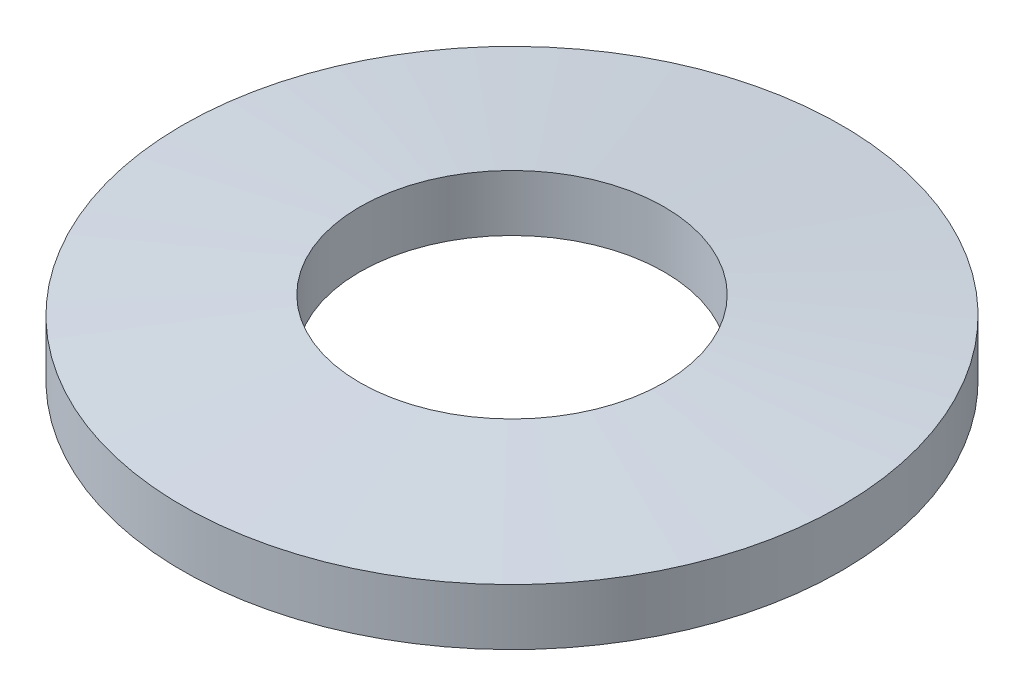
ISO-10303-21;
HEADER;
FILE_DESCRIPTION(('STEP AP214'),'2;1');
FILE_NAME('part.step','',(''),(''),'','','');
FILE_SCHEMA(('AUTOMOTIVE_DESIGN { 1 0 10303 214 1 1 1 1 }'));
ENDSEC;
DATA;
#1=APPLICATION_CONTEXT('core data for automotive mechanical design processes');
#2=APPLICATION_PROTOCOL_DEFINITION('international standard','automotive_design',2000,#1);
#3=PRODUCT_CONTEXT('',#1,'mechanical');
#4=PRODUCT('Part','Part','',(#3));
#5=PRODUCT_RELATED_PRODUCT_CATEGORY('part','',(#4));
#6=PRODUCT_DEFINITION_FORMATION('','',#4);
#7=PRODUCT_DEFINITION_CONTEXT('part definition',#1,'design');
#8=PRODUCT_DEFINITION('design','',#6,#7);
#9=PRODUCT_DEFINITION_SHAPE('','',#8);
#10=(LENGTH_UNIT() NAMED_UNIT(*) SI_UNIT(.MILLI.,.METRE.));
#11=(NAMED_UNIT(*) PLANE_ANGLE_UNIT() SI_UNIT($,.RADIAN.));
#12=(NAMED_UNIT(*) SI_UNIT($,.STERADIAN.) SOLID_ANGLE_UNIT());
#13=UNCERTAINTY_MEASURE_WITH_UNIT(LENGTH_MEASURE(1.E-05),#10,'distance_accuracy_value','');
#14=(GEOMETRIC_REPRESENTATION_CONTEXT(3) GLOBAL_UNCERTAINTY_ASSIGNED_CONTEXT((#13)) GLOBAL_UNIT_ASSIGNED_CONTEXT((#10,
#11,#12)) REPRESENTATION_CONTEXT('',''));
#15=CARTESIAN_POINT('',(0.,0.,0.));
#16=DIRECTION('',(0.,0.,1.));
#17=DIRECTION('',(1.,0.,0.));
#18=AXIS2_PLACEMENT_3D('',#15,#16,#17);
#19=CARTESIAN_POINT('',(0.,21.40585,0.));
#20=DIRECTION('',(0.,-1.,0.));
#21=DIRECTION('',(0.,0.,-1.));
#22=AXIS2_PLACEMENT_3D('',#19,#20,#21);
#23=CONICAL_SURFACE('',#22,3.2258,1.46978988245967);
#24=CARTESIAN_POINT('',(0.,21.02485,0.));
#25=DIRECTION('',(0.,-1.,0.));
#26=DIRECTION('',(-0.104021762769689,0.,-0.994575021237858));
#27=AXIS2_PLACEMENT_3D('',#24,#25,#26);
#28=CIRCLE('',#27,6.985);
#29=CARTESIAN_POINT('',(-0.726592012946279,21.02485,-6.94710652334644));
#30=VERTEX_POINT('',#29);
#31=EDGE_CURVE('E35',#30,#30,#28,.F.);
#32=ORIENTED_EDGE('',*,*,#31,.F.);
#33=EDGE_LOOP('',(#32));
#34=FACE_BOUND('',#33,.T.);
#35=CARTESIAN_POINT('',(0.,21.40585,0.));
#36=DIRECTION('',(0.,-1.,0.));
#37=DIRECTION('',(-0.104021762769689,0.,-0.994575021237859));
#38=AXIS2_PLACEMENT_3D('',#35,#36,#37);
#39=CIRCLE('',#38,3.2258);
#40=CARTESIAN_POINT('',(-0.335553402342463,21.40585,-3.20830010350908));
#41=VERTEX_POINT('',#40);
#42=EDGE_CURVE('E26',#41,#41,#39,.T.);
#43=ORIENTED_EDGE('',*,*,#42,.F.);
#44=EDGE_LOOP('',(#43));
#45=FACE_BOUND('',#44,.T.);
#46=ADVANCED_FACE('F14',(#34,#45),#23,.F.);
#47=CARTESIAN_POINT('',(0.,22.21865,0.));
#48=DIRECTION('',(0.,-1.,0.));
#49=DIRECTION('',(0.,0.,-1.));
#50=AXIS2_PLACEMENT_3D('',#47,#48,#49);
#51=CYLINDRICAL_SURFACE('',#50,6.985);
#52=CARTESIAN_POINT('',(0.,22.2186499528748,0.));
#53=DIRECTION('',(0.,-1.,0.));
#54=DIRECTION('',(-0.104021762769689,0.,-0.994575021237858));
#55=AXIS2_PLACEMENT_3D('',#52,#53,#54);
#56=CIRCLE('',#55,6.9849999952238);
#57=CARTESIAN_POINT('',(-0.72659201244945,22.2186499528748,-6.94710651859615));
#58=VERTEX_POINT('',#57);
#59=EDGE_CURVE('E21',#58,#58,#56,.F.);
#60=ORIENTED_EDGE('',*,*,#59,.F.);
#61=EDGE_LOOP('',(#60));
#62=FACE_BOUND('',#61,.T.);
#63=ORIENTED_EDGE('',*,*,#31,.T.);
#64=EDGE_LOOP('',(#63));
#65=FACE_BOUND('',#64,.T.);
#66=ADVANCED_FACE('F40',(#62,#65),#51,.T.);
#67=CARTESIAN_POINT('',(0.,22.59965,0.));
#68=DIRECTION('',(0.,-1.,0.));
#69=DIRECTION('',(0.,0.,-1.));
#70=AXIS2_PLACEMENT_3D('',#67,#68,#69);
#71=CYLINDRICAL_SURFACE('',#70,3.2258);
#72=ORIENTED_EDGE('',*,*,#42,.T.);
#73=EDGE_LOOP('',(#72));
#74=FACE_BOUND('',#73,.T.);
#75=CARTESIAN_POINT('',(0.,22.5996500471252,0.));
#76=DIRECTION('',(0.,-1.,0.));
#77=DIRECTION('',(-0.104021762769689,0.,-0.994575021237858));
#78=AXIS2_PLACEMENT_3D('',#75,#76,#77);
#79=CIRCLE('',#78,3.2258000047762);
#80=CARTESIAN_POINT('',(-0.335553402839293,22.5996500471252,-3.20830010825937));
#81=VERTEX_POINT('',#80);
#82=EDGE_CURVE('E9',#81,#81,#79,.T.);
#83=ORIENTED_EDGE('',*,*,#82,.F.);
#84=EDGE_LOOP('',(#83));
#85=FACE_BOUND('',#84,.T.);
#86=ADVANCED_FACE('F46',(#74,#85),#71,.F.);
#87=CARTESIAN_POINT('',(0.,22.5996500471252,0.));
#88=DIRECTION('',(0.,-1.,0.));
#89=DIRECTION('',(0.,0.,-1.));
#90=AXIS2_PLACEMENT_3D('',#87,#88,#89);
#91=CONICAL_SURFACE('',#90,3.2258000047762,1.46978985738776);
#92=ORIENTED_EDGE('',*,*,#82,.T.);
#93=EDGE_LOOP('',(#92));
#94=FACE_BOUND('',#93,.T.);
#95=ORIENTED_EDGE('',*,*,#59,.T.);
#96=EDGE_LOOP('',(#95));
#97=FACE_BOUND('',#96,.T.);
#98=ADVANCED_FACE('F49',(#94,#97),#91,.T.);
#99=CLOSED_SHELL('',(#46,#66,#86,#98));
#100=MANIFOLD_SOLID_BREP('B1',#99);
#101=ADVANCED_BREP_SHAPE_REPRESENTATION('',(#18,#100),#14);
#102=SHAPE_DEFINITION_REPRESENTATION(#9,#101);
ENDSEC;
END-ISO-10303-21;
